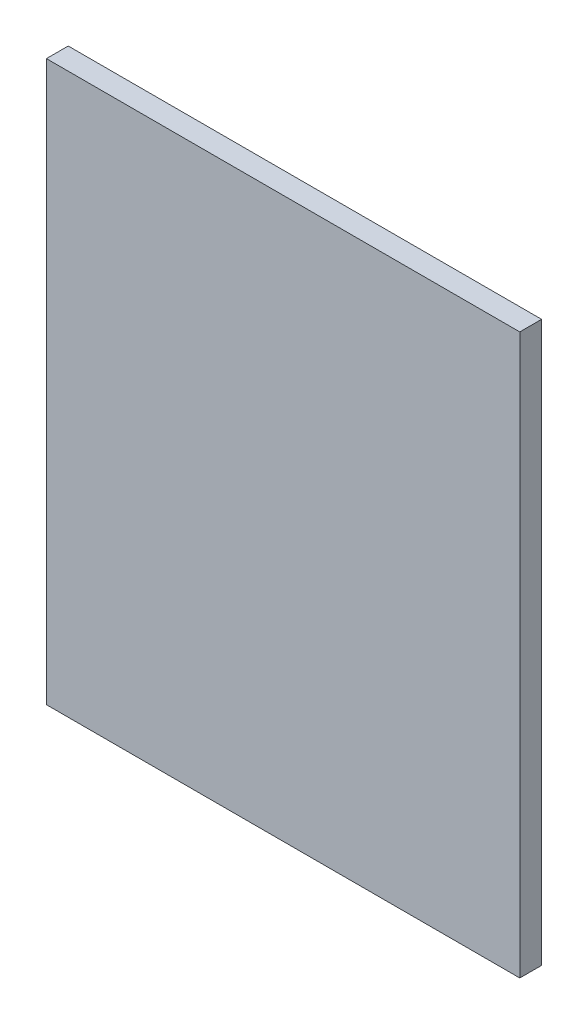
ISO-10303-21;
HEADER;
FILE_DESCRIPTION(('STEP AP214'),'2;1');
FILE_NAME('part.step','',(''),(''),'','','');
FILE_SCHEMA(('AUTOMOTIVE_DESIGN { 1 0 10303 214 1 1 1 1 }'));
ENDSEC;
DATA;
#1=APPLICATION_CONTEXT('core data for automotive mechanical design processes');
#2=APPLICATION_PROTOCOL_DEFINITION('international standard','automotive_design',2000,#1);
#3=PRODUCT_CONTEXT('',#1,'mechanical');
#4=PRODUCT('Part','Part','',(#3));
#5=PRODUCT_RELATED_PRODUCT_CATEGORY('part','',(#4));
#6=PRODUCT_DEFINITION_FORMATION('','',#4);
#7=PRODUCT_DEFINITION_CONTEXT('part definition',#1,'design');
#8=PRODUCT_DEFINITION('design','',#6,#7);
#9=PRODUCT_DEFINITION_SHAPE('','',#8);
#10=(LENGTH_UNIT() NAMED_UNIT(*) SI_UNIT(.MILLI.,.METRE.));
#11=(NAMED_UNIT(*) PLANE_ANGLE_UNIT() SI_UNIT($,.RADIAN.));
#12=(NAMED_UNIT(*) SI_UNIT($,.STERADIAN.) SOLID_ANGLE_UNIT());
#13=UNCERTAINTY_MEASURE_WITH_UNIT(LENGTH_MEASURE(1.E-05),#10,'distance_accuracy_value','');
#14=(GEOMETRIC_REPRESENTATION_CONTEXT(3) GLOBAL_UNCERTAINTY_ASSIGNED_CONTEXT((#13)) GLOBAL_UNIT_ASSIGNED_CONTEXT((#10,
#11,#12)) REPRESENTATION_CONTEXT('',''));
#15=CARTESIAN_POINT('',(0.,0.,0.));
#16=DIRECTION('',(0.,0.,1.));
#17=DIRECTION('',(1.,0.,0.));
#18=AXIS2_PLACEMENT_3D('',#15,#16,#17);
#19=CARTESIAN_POINT('',(0.,0.,0.));
#20=DIRECTION('',(0.,0.,1.));
#21=DIRECTION('',(1.,0.,0.));
#22=AXIS2_PLACEMENT_3D('',#19,#20,#21);
#23=PLANE('',#22);
#24=DIRECTION('',(-1.,0.,0.));
#25=VECTOR('',#24,1.);
#26=CARTESIAN_POINT('',(-93.4457314106681,-53.4,0.));
#27=LINE('',#26,#25);
#28=CARTESIAN_POINT('',(-26.3457314106681,-53.4,0.));
#29=VERTEX_POINT('',#28);
#30=CARTESIAN_POINT('',(-69.745731410668,-53.4,0.));
#31=VERTEX_POINT('',#30);
#32=EDGE_CURVE('E95',#29,#31,#27,.T.);
#33=ORIENTED_EDGE('',*,*,#32,.T.);
#34=DIRECTION('',(0.,1.,0.));
#35=VECTOR('',#34,1.);
#36=CARTESIAN_POINT('',(-69.745731410668,0.,0.));
#37=LINE('',#36,#35);
#38=CARTESIAN_POINT('',(-69.745731410668,-2.10000000000001,0.));
#39=VERTEX_POINT('',#38);
#40=EDGE_CURVE('E50',#31,#39,#37,.T.);
#41=ORIENTED_EDGE('',*,*,#40,.T.);
#42=DIRECTION('',(-1.,0.,0.));
#43=VECTOR('',#42,1.);
#44=CARTESIAN_POINT('',(0.,-2.1,0.));
#45=LINE('',#44,#43);
#46=CARTESIAN_POINT('',(-26.3457314106681,-2.1,0.));
#47=VERTEX_POINT('',#46);
#48=EDGE_CURVE('E101',#47,#39,#45,.T.);
#49=ORIENTED_EDGE('',*,*,#48,.F.);
#50=DIRECTION('',(0.,1.,0.));
#51=VECTOR('',#50,1.);
#52=CARTESIAN_POINT('',(-26.3457314106681,0.,0.));
#53=LINE('',#52,#51);
#54=EDGE_CURVE('E59',#29,#47,#53,.T.);
#55=ORIENTED_EDGE('',*,*,#54,.F.);
#56=EDGE_LOOP('',(#33,#41,#49,#55));
#57=FACE_BOUND('',#56,.T.);
#58=ADVANCED_FACE('F37',(#57),#23,.F.);
#59=CARTESIAN_POINT('',(-26.3457314106681,0.,0.));
#60=DIRECTION('',(1.,0.,0.));
#61=DIRECTION('',(0.,0.,-1.));
#62=AXIS2_PLACEMENT_3D('',#59,#60,#61);
#63=PLANE('',#62);
#64=DIRECTION('',(0.,1.,0.));
#65=VECTOR('',#64,1.);
#66=CARTESIAN_POINT('',(-26.3457314106681,0.,2.));
#67=LINE('',#66,#65);
#68=CARTESIAN_POINT('',(-26.3457314106681,-53.4,2.));
#69=VERTEX_POINT('',#68);
#70=CARTESIAN_POINT('',(-26.3457314106681,-2.1,2.));
#71=VERTEX_POINT('',#70);
#72=EDGE_CURVE('E104',#69,#71,#67,.T.);
#73=ORIENTED_EDGE('',*,*,#72,.F.);
#74=DIRECTION('',(0.,0.,1.));
#75=VECTOR('',#74,1.);
#76=CARTESIAN_POINT('',(-26.3457314106681,-53.4,-67.7008862571237));
#77=LINE('',#76,#75);
#78=EDGE_CURVE('E93',#29,#69,#77,.T.);
#79=ORIENTED_EDGE('',*,*,#78,.F.);
#80=ORIENTED_EDGE('',*,*,#54,.T.);
#81=DIRECTION('',(0.,0.,1.));
#82=VECTOR('',#81,1.);
#83=CARTESIAN_POINT('',(-26.3457314106681,-2.1,0.));
#84=LINE('',#83,#82);
#85=EDGE_CURVE('E44',#47,#71,#84,.T.);
#86=ORIENTED_EDGE('',*,*,#85,.T.);
#87=EDGE_LOOP('',(#73,#79,#80,#86));
#88=FACE_BOUND('',#87,.T.);
#89=ADVANCED_FACE('F107',(#88),#63,.T.);
#90=CARTESIAN_POINT('',(0.,-2.1,0.));
#91=DIRECTION('',(0.,1.,0.));
#92=DIRECTION('',(-1.,0.,0.));
#93=AXIS2_PLACEMENT_3D('',#90,#91,#92);
#94=PLANE('',#93);
#95=DIRECTION('',(0.,0.,1.));
#96=VECTOR('',#95,1.);
#97=CARTESIAN_POINT('',(-69.745731410668,-2.10000000000001,-8.));
#98=LINE('',#97,#96);
#99=CARTESIAN_POINT('',(-69.745731410668,-2.10000000000001,2.));
#100=VERTEX_POINT('',#99);
#101=EDGE_CURVE('E89',#39,#100,#98,.T.);
#102=ORIENTED_EDGE('',*,*,#101,.T.);
#103=DIRECTION('',(-1.,0.,0.));
#104=VECTOR('',#103,1.);
#105=CARTESIAN_POINT('',(0.,-2.1,2.));
#106=LINE('',#105,#104);
#107=EDGE_CURVE('E88',#71,#100,#106,.T.);
#108=ORIENTED_EDGE('',*,*,#107,.F.);
#109=ORIENTED_EDGE('',*,*,#85,.F.);
#110=ORIENTED_EDGE('',*,*,#48,.T.);
#111=EDGE_LOOP('',(#102,#108,#109,#110));
#112=FACE_BOUND('',#111,.T.);
#113=ADVANCED_FACE('F110',(#112),#94,.T.);
#114=CARTESIAN_POINT('',(0.,0.,2.));
#115=DIRECTION('',(0.,0.,1.));
#116=DIRECTION('',(1.,0.,0.));
#117=AXIS2_PLACEMENT_3D('',#114,#115,#116);
#118=PLANE('',#117);
#119=DIRECTION('',(0.,1.,0.));
#120=VECTOR('',#119,1.);
#121=CARTESIAN_POINT('',(-69.745731410668,-2.10000000000001,2.));
#122=LINE('',#121,#120);
#123=CARTESIAN_POINT('',(-69.745731410668,-53.4,2.));
#124=VERTEX_POINT('',#123);
#125=EDGE_CURVE('E75',#124,#100,#122,.T.);
#126=ORIENTED_EDGE('',*,*,#125,.F.);
#127=DIRECTION('',(1.,0.,0.));
#128=VECTOR('',#127,1.);
#129=CARTESIAN_POINT('',(-93.4457314106681,-53.4,2.));
#130=LINE('',#129,#128);
#131=EDGE_CURVE('E85',#124,#69,#130,.T.);
#132=ORIENTED_EDGE('',*,*,#131,.T.);
#133=ORIENTED_EDGE('',*,*,#72,.T.);
#134=ORIENTED_EDGE('',*,*,#107,.T.);
#135=EDGE_LOOP('',(#126,#132,#133,#134));
#136=FACE_BOUND('',#135,.T.);
#137=ADVANCED_FACE('F83',(#136),#118,.T.);
#138=CARTESIAN_POINT('',(-93.4457314106681,-53.4,-67.7008862571237));
#139=DIRECTION('',(0.,-1.,0.));
#140=DIRECTION('',(0.,0.,-1.));
#141=AXIS2_PLACEMENT_3D('',#138,#139,#140);
#142=PLANE('',#141);
#143=DIRECTION('',(0.,0.,1.));
#144=VECTOR('',#143,1.);
#145=CARTESIAN_POINT('',(-69.745731410668,-53.4,-67.7008862571237));
#146=LINE('',#145,#144);
#147=EDGE_CURVE('E11',#31,#124,#146,.T.);
#148=ORIENTED_EDGE('',*,*,#147,.F.);
#149=ORIENTED_EDGE('',*,*,#32,.F.);
#150=ORIENTED_EDGE('',*,*,#78,.T.);
#151=ORIENTED_EDGE('',*,*,#131,.F.);
#152=EDGE_LOOP('',(#148,#149,#150,#151));
#153=FACE_BOUND('',#152,.T.);
#154=ADVANCED_FACE('F92',(#153),#142,.T.);
#155=CARTESIAN_POINT('',(-69.745731410668,-2.10000000000001,-8.));
#156=DIRECTION('',(1.,0.,0.));
#157=DIRECTION('',(0.,0.,-1.));
#158=AXIS2_PLACEMENT_3D('',#155,#156,#157);
#159=PLANE('',#158);
#160=ORIENTED_EDGE('',*,*,#147,.T.);
#161=ORIENTED_EDGE('',*,*,#125,.T.);
#162=ORIENTED_EDGE('',*,*,#101,.F.);
#163=ORIENTED_EDGE('',*,*,#40,.F.);
#164=EDGE_LOOP('',(#160,#161,#162,#163));
#165=FACE_BOUND('',#164,.T.);
#166=ADVANCED_FACE('F74',(#165),#159,.F.);
#167=CLOSED_SHELL('',(#58,#89,#113,#137,#154,#166));
#168=MANIFOLD_SOLID_BREP('B2',#167);
#169=ADVANCED_BREP_SHAPE_REPRESENTATION('',(#18,#168),#14);
#170=SHAPE_DEFINITION_REPRESENTATION(#9,#169);
ENDSEC;
END-ISO-10303-21;
